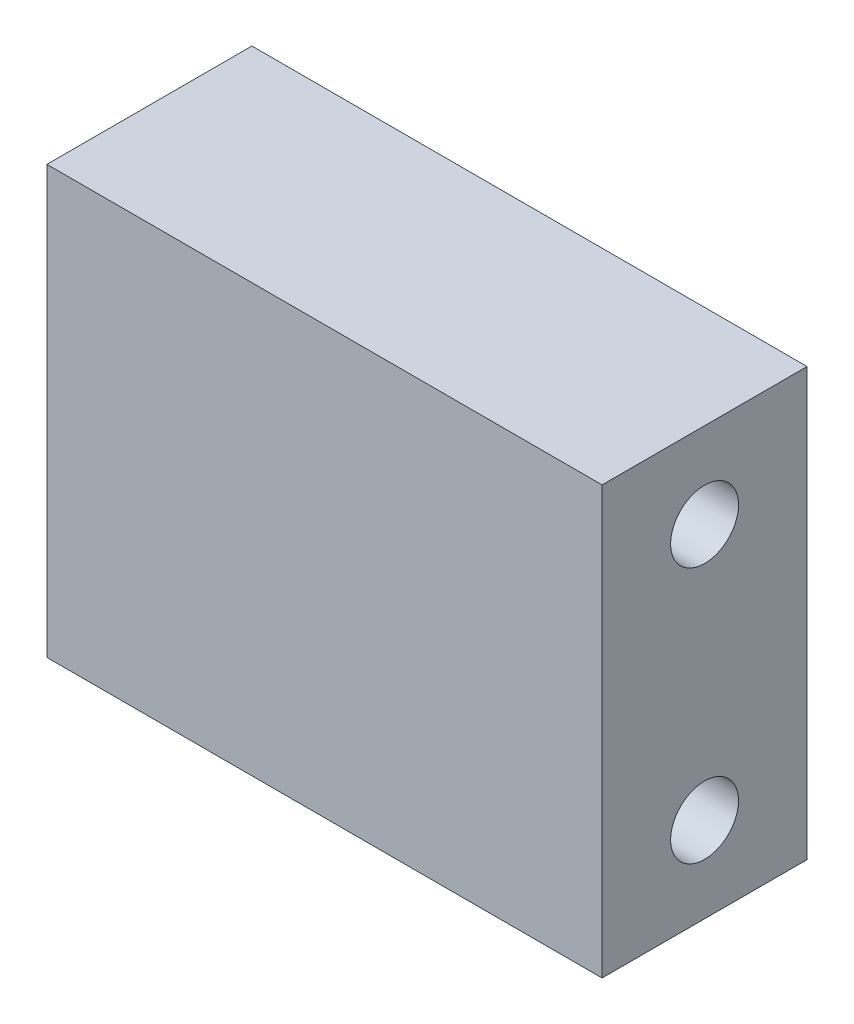
ISO-10303-21;
HEADER;
FILE_DESCRIPTION(('STEP AP214'),'2;1');
FILE_NAME('part.step','',(''),(''),'','','');
FILE_SCHEMA(('AUTOMOTIVE_DESIGN { 1 0 10303 214 1 1 1 1 }'));
ENDSEC;
DATA;
#1=APPLICATION_CONTEXT('core data for automotive mechanical design processes');
#2=APPLICATION_PROTOCOL_DEFINITION('international standard','automotive_design',2000,#1);
#3=PRODUCT_CONTEXT('',#1,'mechanical');
#4=PRODUCT('Part','Part','',(#3));
#5=PRODUCT_RELATED_PRODUCT_CATEGORY('part','',(#4));
#6=PRODUCT_DEFINITION_FORMATION('','',#4);
#7=PRODUCT_DEFINITION_CONTEXT('part definition',#1,'design');
#8=PRODUCT_DEFINITION('design','',#6,#7);
#9=PRODUCT_DEFINITION_SHAPE('','',#8);
#10=(LENGTH_UNIT() NAMED_UNIT(*) SI_UNIT(.MILLI.,.METRE.));
#11=(NAMED_UNIT(*) PLANE_ANGLE_UNIT() SI_UNIT($,.RADIAN.));
#12=(NAMED_UNIT(*) SI_UNIT($,.STERADIAN.) SOLID_ANGLE_UNIT());
#13=UNCERTAINTY_MEASURE_WITH_UNIT(LENGTH_MEASURE(1.E-05),#10,'distance_accuracy_value','');
#14=(GEOMETRIC_REPRESENTATION_CONTEXT(3) GLOBAL_UNCERTAINTY_ASSIGNED_CONTEXT((#13)) GLOBAL_UNIT_ASSIGNED_CONTEXT((#10,
#11,#12)) REPRESENTATION_CONTEXT('',''));
#15=CARTESIAN_POINT('',(0.,0.,0.));
#16=DIRECTION('',(0.,0.,1.));
#17=DIRECTION('',(1.,0.,0.));
#18=AXIS2_PLACEMENT_3D('',#15,#16,#17);
#19=CARTESIAN_POINT('',(16.51,12.7,-6.096));
#20=DIRECTION('',(0.,0.,1.));
#21=DIRECTION('',(0.,-1.,0.));
#22=AXIS2_PLACEMENT_3D('',#19,#20,#21);
#23=PLANE('',#22);
#24=DIRECTION('',(0.,1.,0.));
#25=VECTOR('',#24,1.);
#26=CARTESIAN_POINT('',(-16.51,12.7,-6.096));
#27=LINE('',#26,#25);
#28=CARTESIAN_POINT('',(-16.51,-12.7,-6.096));
#29=VERTEX_POINT('',#28);
#30=CARTESIAN_POINT('',(-16.51,12.7,-6.096));
#31=VERTEX_POINT('',#30);
#32=EDGE_CURVE('E145',#29,#31,#27,.T.);
#33=ORIENTED_EDGE('',*,*,#32,.T.);
#34=DIRECTION('',(-1.,0.,0.));
#35=VECTOR('',#34,1.);
#36=CARTESIAN_POINT('',(16.51,12.7,-6.096));
#37=LINE('',#36,#35);
#38=CARTESIAN_POINT('',(16.51,12.7,-6.096));
#39=VERTEX_POINT('',#38);
#40=EDGE_CURVE('E11',#39,#31,#37,.T.);
#41=ORIENTED_EDGE('',*,*,#40,.F.);
#42=DIRECTION('',(0.,1.,0.));
#43=VECTOR('',#42,1.);
#44=CARTESIAN_POINT('',(16.51,12.7,-6.096));
#45=LINE('',#44,#43);
#46=CARTESIAN_POINT('',(16.51,-12.7,-6.096));
#47=VERTEX_POINT('',#46);
#48=EDGE_CURVE('E146',#47,#39,#45,.T.);
#49=ORIENTED_EDGE('',*,*,#48,.F.);
#50=DIRECTION('',(-1.,0.,0.));
#51=VECTOR('',#50,1.);
#52=CARTESIAN_POINT('',(16.51,-12.7,-6.096));
#53=LINE('',#52,#51);
#54=EDGE_CURVE('E156',#47,#29,#53,.T.);
#55=ORIENTED_EDGE('',*,*,#54,.T.);
#56=EDGE_LOOP('',(#33,#41,#49,#55));
#57=FACE_BOUND('',#56,.T.);
#58=ADVANCED_FACE('F43',(#57),#23,.F.);
#59=CARTESIAN_POINT('',(16.51,12.7,6.096));
#60=DIRECTION('',(0.,-1.,0.));
#61=DIRECTION('',(0.,0.,-1.));
#62=AXIS2_PLACEMENT_3D('',#59,#60,#61);
#63=PLANE('',#62);
#64=DIRECTION('',(0.,0.,1.));
#65=VECTOR('',#64,1.);
#66=CARTESIAN_POINT('',(-16.51,12.7,6.096));
#67=LINE('',#66,#65);
#68=CARTESIAN_POINT('',(-16.51,12.7,6.096));
#69=VERTEX_POINT('',#68);
#70=EDGE_CURVE('E160',#31,#69,#67,.T.);
#71=ORIENTED_EDGE('',*,*,#70,.T.);
#72=DIRECTION('',(-1.,0.,0.));
#73=VECTOR('',#72,1.);
#74=CARTESIAN_POINT('',(16.51,12.7,6.096));
#75=LINE('',#74,#73);
#76=CARTESIAN_POINT('',(16.51,12.7,6.096));
#77=VERTEX_POINT('',#76);
#78=EDGE_CURVE('E52',#77,#69,#75,.T.);
#79=ORIENTED_EDGE('',*,*,#78,.F.);
#80=DIRECTION('',(0.,0.,1.));
#81=VECTOR('',#80,1.);
#82=CARTESIAN_POINT('',(16.51,12.7,6.096));
#83=LINE('',#82,#81);
#84=EDGE_CURVE('E91',#39,#77,#83,.T.);
#85=ORIENTED_EDGE('',*,*,#84,.F.);
#86=ORIENTED_EDGE('',*,*,#40,.T.);
#87=EDGE_LOOP('',(#71,#79,#85,#86));
#88=FACE_BOUND('',#87,.T.);
#89=ADVANCED_FACE('F190',(#88),#63,.F.);
#90=CARTESIAN_POINT('',(16.51,12.7,6.096));
#91=DIRECTION('',(0.,0.,-1.));
#92=DIRECTION('',(0.,1.,0.));
#93=AXIS2_PLACEMENT_3D('',#90,#91,#92);
#94=PLANE('',#93);
#95=DIRECTION('',(0.,-1.,0.));
#96=VECTOR('',#95,1.);
#97=CARTESIAN_POINT('',(-16.51,12.7,6.096));
#98=LINE('',#97,#96);
#99=CARTESIAN_POINT('',(-16.51,-12.7,6.096));
#100=VERTEX_POINT('',#99);
#101=EDGE_CURVE('E78',#69,#100,#98,.T.);
#102=ORIENTED_EDGE('',*,*,#101,.T.);
#103=DIRECTION('',(-1.,0.,0.));
#104=VECTOR('',#103,1.);
#105=CARTESIAN_POINT('',(16.51,-12.7,6.096));
#106=LINE('',#105,#104);
#107=CARTESIAN_POINT('',(16.51,-12.7,6.096));
#108=VERTEX_POINT('',#107);
#109=EDGE_CURVE('E169',#108,#100,#106,.T.);
#110=ORIENTED_EDGE('',*,*,#109,.F.);
#111=DIRECTION('',(0.,-1.,0.));
#112=VECTOR('',#111,1.);
#113=CARTESIAN_POINT('',(16.51,12.7,6.096));
#114=LINE('',#113,#112);
#115=EDGE_CURVE('E151',#77,#108,#114,.T.);
#116=ORIENTED_EDGE('',*,*,#115,.F.);
#117=ORIENTED_EDGE('',*,*,#78,.T.);
#118=EDGE_LOOP('',(#102,#110,#116,#117));
#119=FACE_BOUND('',#118,.T.);
#120=ADVANCED_FACE('F173',(#119),#94,.F.);
#121=CARTESIAN_POINT('',(16.51,-12.7,6.096));
#122=DIRECTION('',(0.,1.,0.));
#123=DIRECTION('',(0.,0.,1.));
#124=AXIS2_PLACEMENT_3D('',#121,#122,#123);
#125=PLANE('',#124);
#126=DIRECTION('',(0.,0.,-1.));
#127=VECTOR('',#126,1.);
#128=CARTESIAN_POINT('',(-16.51,-12.7,6.096));
#129=LINE('',#128,#127);
#130=EDGE_CURVE('E84',#100,#29,#129,.T.);
#131=ORIENTED_EDGE('',*,*,#130,.T.);
#132=ORIENTED_EDGE('',*,*,#54,.F.);
#133=DIRECTION('',(0.,0.,-1.));
#134=VECTOR('',#133,1.);
#135=CARTESIAN_POINT('',(16.51,-12.7,6.096));
#136=LINE('',#135,#134);
#137=EDGE_CURVE('E60',#108,#47,#136,.T.);
#138=ORIENTED_EDGE('',*,*,#137,.F.);
#139=ORIENTED_EDGE('',*,*,#109,.T.);
#140=EDGE_LOOP('',(#131,#132,#138,#139));
#141=FACE_BOUND('',#140,.T.);
#142=ADVANCED_FACE('F180',(#141),#125,.F.);
#143=CARTESIAN_POINT('',(16.51,0.,0.));
#144=DIRECTION('',(1.,0.,0.));
#145=DIRECTION('',(0.,0.,-1.));
#146=AXIS2_PLACEMENT_3D('',#143,#144,#145);
#147=PLANE('',#146);
#148=CARTESIAN_POINT('',(16.51,7.62,0.));
#149=DIRECTION('',(1.,0.,0.));
#150=DIRECTION('',(0.,0.,-1.));
#151=AXIS2_PLACEMENT_3D('',#148,#149,#150);
#152=CIRCLE('',#151,2.0193);
#153=CARTESIAN_POINT('',(16.51,7.62,-2.0193));
#154=VERTEX_POINT('',#153);
#155=EDGE_CURVE('E129',#154,#154,#152,.T.);
#156=ORIENTED_EDGE('',*,*,#155,.F.);
#157=EDGE_LOOP('',(#156));
#158=FACE_BOUND('',#157,.T.);
#159=CARTESIAN_POINT('',(16.51,-7.62,0.));
#160=DIRECTION('',(1.,0.,0.));
#161=DIRECTION('',(0.,0.,-1.));
#162=AXIS2_PLACEMENT_3D('',#159,#160,#161);
#163=CIRCLE('',#162,2.0193);
#164=CARTESIAN_POINT('',(16.51,-7.62,-2.0193));
#165=VERTEX_POINT('',#164);
#166=EDGE_CURVE('E137',#165,#165,#163,.T.);
#167=ORIENTED_EDGE('',*,*,#166,.F.);
#168=EDGE_LOOP('',(#167));
#169=FACE_BOUND('',#168,.T.);
#170=ORIENTED_EDGE('',*,*,#48,.T.);
#171=ORIENTED_EDGE('',*,*,#84,.T.);
#172=ORIENTED_EDGE('',*,*,#115,.T.);
#173=ORIENTED_EDGE('',*,*,#137,.T.);
#174=EDGE_LOOP('',(#170,#171,#172,#173));
#175=FACE_BOUND('',#174,.T.);
#176=ADVANCED_FACE('F182',(#158,#169,#175),#147,.T.);
#177=CARTESIAN_POINT('',(-16.51,0.,0.));
#178=DIRECTION('',(1.,0.,0.));
#179=DIRECTION('',(0.,0.,-1.));
#180=AXIS2_PLACEMENT_3D('',#177,#178,#179);
#181=PLANE('',#180);
#182=CARTESIAN_POINT('',(-16.51,7.62,0.));
#183=DIRECTION('',(-1.,0.,0.));
#184=DIRECTION('',(0.,0.,1.));
#185=AXIS2_PLACEMENT_3D('',#182,#183,#184);
#186=CIRCLE('',#185,2.0193);
#187=CARTESIAN_POINT('',(-16.51,7.62,2.0193));
#188=VERTEX_POINT('',#187);
#189=EDGE_CURVE('E116',#188,#188,#186,.T.);
#190=ORIENTED_EDGE('',*,*,#189,.F.);
#191=EDGE_LOOP('',(#190));
#192=FACE_BOUND('',#191,.T.);
#193=CARTESIAN_POINT('',(-16.51,-7.62,0.));
#194=DIRECTION('',(-1.,0.,0.));
#195=DIRECTION('',(0.,0.,1.));
#196=AXIS2_PLACEMENT_3D('',#193,#194,#195);
#197=CIRCLE('',#196,2.0193);
#198=CARTESIAN_POINT('',(-16.51,-7.62,2.0193));
#199=VERTEX_POINT('',#198);
#200=EDGE_CURVE('E115',#199,#199,#197,.T.);
#201=ORIENTED_EDGE('',*,*,#200,.F.);
#202=EDGE_LOOP('',(#201));
#203=FACE_BOUND('',#202,.T.);
#204=ORIENTED_EDGE('',*,*,#32,.F.);
#205=ORIENTED_EDGE('',*,*,#130,.F.);
#206=ORIENTED_EDGE('',*,*,#101,.F.);
#207=ORIENTED_EDGE('',*,*,#70,.F.);
#208=EDGE_LOOP('',(#204,#205,#206,#207));
#209=FACE_BOUND('',#208,.T.);
#210=ADVANCED_FACE('F176',(#192,#203,#209),#181,.F.);
#211=CARTESIAN_POINT('',(6.35,-7.62,0.));
#212=DIRECTION('',(1.,0.,0.));
#213=DIRECTION('',(0.,0.,-1.));
#214=AXIS2_PLACEMENT_3D('',#211,#212,#213);
#215=CONICAL_SURFACE('',#214,2.0193,1.02974425867665);
#216=CARTESIAN_POINT('',(5.13668215199765,-7.62,0.));
#217=VERTEX_POINT('',#216);
#218=VERTEX_LOOP('',#217);
#219=FACE_BOUND('',#218,.T.);
#220=CARTESIAN_POINT('',(6.35,-7.62,0.));
#221=DIRECTION('',(1.,0.,0.));
#222=DIRECTION('',(0.,0.,-1.));
#223=AXIS2_PLACEMENT_3D('',#220,#221,#222);
#224=CIRCLE('',#223,2.0193);
#225=CARTESIAN_POINT('',(6.35,-7.62,-2.0193));
#226=VERTEX_POINT('',#225);
#227=EDGE_CURVE('E141',#226,#226,#224,.T.);
#228=ORIENTED_EDGE('',*,*,#227,.T.);
#229=EDGE_LOOP('',(#228));
#230=FACE_BOUND('',#229,.T.);
#231=ADVANCED_FACE('F223',(#219,#230),#215,.F.);
#232=CARTESIAN_POINT('',(16.51,-7.62,0.));
#233=DIRECTION('',(1.,0.,0.));
#234=DIRECTION('',(0.,0.,-1.));
#235=AXIS2_PLACEMENT_3D('',#232,#233,#234);
#236=CYLINDRICAL_SURFACE('',#235,2.0193);
#237=ORIENTED_EDGE('',*,*,#227,.F.);
#238=EDGE_LOOP('',(#237));
#239=FACE_BOUND('',#238,.T.);
#240=ORIENTED_EDGE('',*,*,#166,.T.);
#241=EDGE_LOOP('',(#240));
#242=FACE_BOUND('',#241,.T.);
#243=ADVANCED_FACE('F228',(#239,#242),#236,.F.);
#244=CARTESIAN_POINT('',(6.35,7.62,0.));
#245=DIRECTION('',(1.,0.,0.));
#246=DIRECTION('',(0.,0.,-1.));
#247=AXIS2_PLACEMENT_3D('',#244,#245,#246);
#248=CONICAL_SURFACE('',#247,2.0193,1.02974425867665);
#249=CARTESIAN_POINT('',(5.13668215199765,7.62,0.));
#250=VERTEX_POINT('',#249);
#251=VERTEX_LOOP('',#250);
#252=FACE_BOUND('',#251,.T.);
#253=CARTESIAN_POINT('',(6.35,7.62,0.));
#254=DIRECTION('',(1.,0.,0.));
#255=DIRECTION('',(0.,0.,-1.));
#256=AXIS2_PLACEMENT_3D('',#253,#254,#255);
#257=CIRCLE('',#256,2.0193);
#258=CARTESIAN_POINT('',(6.35,7.62,-2.01929999999999));
#259=VERTEX_POINT('',#258);
#260=EDGE_CURVE('E133',#259,#259,#257,.T.);
#261=ORIENTED_EDGE('',*,*,#260,.T.);
#262=EDGE_LOOP('',(#261));
#263=FACE_BOUND('',#262,.T.);
#264=ADVANCED_FACE('F239',(#252,#263),#248,.F.);
#265=CARTESIAN_POINT('',(16.51,7.62,0.));
#266=DIRECTION('',(1.,0.,0.));
#267=DIRECTION('',(0.,0.,-1.));
#268=AXIS2_PLACEMENT_3D('',#265,#266,#267);
#269=CYLINDRICAL_SURFACE('',#268,2.0193);
#270=ORIENTED_EDGE('',*,*,#260,.F.);
#271=EDGE_LOOP('',(#270));
#272=FACE_BOUND('',#271,.T.);
#273=ORIENTED_EDGE('',*,*,#155,.T.);
#274=EDGE_LOOP('',(#273));
#275=FACE_BOUND('',#274,.T.);
#276=ADVANCED_FACE('F250',(#272,#275),#269,.F.);
#277=CARTESIAN_POINT('',(-6.35,-7.62,0.));
#278=DIRECTION('',(-1.,0.,0.));
#279=DIRECTION('',(0.,0.,1.));
#280=AXIS2_PLACEMENT_3D('',#277,#278,#279);
#281=CONICAL_SURFACE('',#280,2.0193,1.02974425867665);
#282=CARTESIAN_POINT('',(-5.13668215199765,-7.62,0.));
#283=VERTEX_POINT('',#282);
#284=VERTEX_LOOP('',#283);
#285=FACE_BOUND('',#284,.T.);
#286=CARTESIAN_POINT('',(-6.35,-7.62,0.));
#287=DIRECTION('',(-1.,0.,0.));
#288=DIRECTION('',(0.,0.,1.));
#289=AXIS2_PLACEMENT_3D('',#286,#287,#288);
#290=CIRCLE('',#289,2.0193);
#291=CARTESIAN_POINT('',(-6.35,-7.62,2.01929999999999));
#292=VERTEX_POINT('',#291);
#293=EDGE_CURVE('E121',#292,#292,#290,.T.);
#294=ORIENTED_EDGE('',*,*,#293,.T.);
#295=EDGE_LOOP('',(#294));
#296=FACE_BOUND('',#295,.T.);
#297=ADVANCED_FACE('F261',(#285,#296),#281,.F.);
#298=CARTESIAN_POINT('',(-16.51,-7.62,0.));
#299=DIRECTION('',(-1.,0.,0.));
#300=DIRECTION('',(0.,0.,1.));
#301=AXIS2_PLACEMENT_3D('',#298,#299,#300);
#302=CYLINDRICAL_SURFACE('',#301,2.0193);
#303=ORIENTED_EDGE('',*,*,#293,.F.);
#304=EDGE_LOOP('',(#303));
#305=FACE_BOUND('',#304,.T.);
#306=ORIENTED_EDGE('',*,*,#200,.T.);
#307=EDGE_LOOP('',(#306));
#308=FACE_BOUND('',#307,.T.);
#309=ADVANCED_FACE('F108',(#305,#308),#302,.F.);
#310=CARTESIAN_POINT('',(-6.35,7.62,0.));
#311=DIRECTION('',(-1.,0.,0.));
#312=DIRECTION('',(0.,0.,1.));
#313=AXIS2_PLACEMENT_3D('',#310,#311,#312);
#314=CONICAL_SURFACE('',#313,2.0193,1.02974425867665);
#315=CARTESIAN_POINT('',(-5.13668215199765,7.62,0.));
#316=VERTEX_POINT('',#315);
#317=VERTEX_LOOP('',#316);
#318=FACE_BOUND('',#317,.T.);
#319=CARTESIAN_POINT('',(-6.35,7.62,0.));
#320=DIRECTION('',(-1.,0.,0.));
#321=DIRECTION('',(0.,0.,1.));
#322=AXIS2_PLACEMENT_3D('',#319,#320,#321);
#323=CIRCLE('',#322,2.0193);
#324=CARTESIAN_POINT('',(-6.35,7.62,2.0193));
#325=VERTEX_POINT('',#324);
#326=EDGE_CURVE('E112',#325,#325,#323,.T.);
#327=ORIENTED_EDGE('',*,*,#326,.T.);
#328=EDGE_LOOP('',(#327));
#329=FACE_BOUND('',#328,.T.);
#330=ADVANCED_FACE('F104',(#318,#329),#314,.F.);
#331=CARTESIAN_POINT('',(-16.51,7.62,0.));
#332=DIRECTION('',(-1.,0.,0.));
#333=DIRECTION('',(0.,0.,1.));
#334=AXIS2_PLACEMENT_3D('',#331,#332,#333);
#335=CYLINDRICAL_SURFACE('',#334,2.0193);
#336=ORIENTED_EDGE('',*,*,#326,.F.);
#337=EDGE_LOOP('',(#336));
#338=FACE_BOUND('',#337,.T.);
#339=ORIENTED_EDGE('',*,*,#189,.T.);
#340=EDGE_LOOP('',(#339));
#341=FACE_BOUND('',#340,.T.);
#342=ADVANCED_FACE('F107',(#338,#341),#335,.F.);
#343=CLOSED_SHELL('',(#58,#89,#120,#142,#176,#210,#231,#243,#264,#276,#297,#309,#330,#342));
#344=MANIFOLD_SOLID_BREP('B2',#343);
#345=ADVANCED_BREP_SHAPE_REPRESENTATION('',(#18,#344),#14);
#346=SHAPE_DEFINITION_REPRESENTATION(#9,#345);
ENDSEC;
END-ISO-10303-21;
